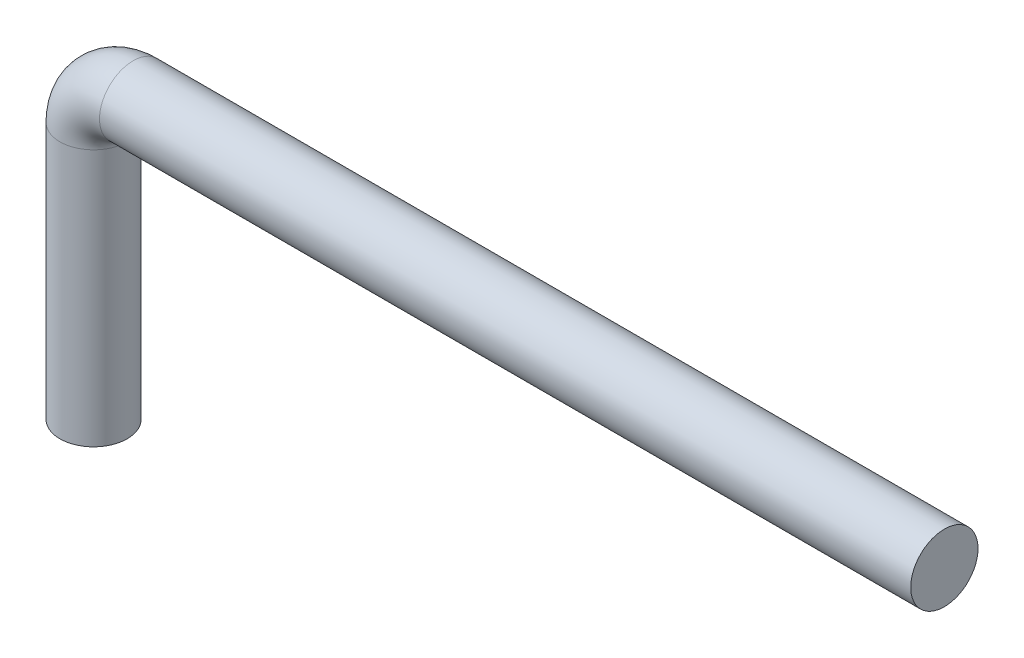
ISO-10303-21;
HEADER;
FILE_DESCRIPTION(('STEP AP214'),'2;1');
FILE_NAME('part.step','',(''),(''),'','','');
FILE_SCHEMA(('AUTOMOTIVE_DESIGN { 1 0 10303 214 1 1 1 1 }'));
ENDSEC;
DATA;
#1=APPLICATION_CONTEXT('core data for automotive mechanical design processes');
#2=APPLICATION_PROTOCOL_DEFINITION('international standard','automotive_design',2000,#1);
#3=PRODUCT_CONTEXT('',#1,'mechanical');
#4=PRODUCT('Part','Part','',(#3));
#5=PRODUCT_RELATED_PRODUCT_CATEGORY('part','',(#4));
#6=PRODUCT_DEFINITION_FORMATION('','',#4);
#7=PRODUCT_DEFINITION_CONTEXT('part definition',#1,'design');
#8=PRODUCT_DEFINITION('design','',#6,#7);
#9=PRODUCT_DEFINITION_SHAPE('','',#8);
#10=(LENGTH_UNIT() NAMED_UNIT(*) SI_UNIT(.MILLI.,.METRE.));
#11=(NAMED_UNIT(*) PLANE_ANGLE_UNIT() SI_UNIT($,.RADIAN.));
#12=(NAMED_UNIT(*) SI_UNIT($,.STERADIAN.) SOLID_ANGLE_UNIT());
#13=UNCERTAINTY_MEASURE_WITH_UNIT(LENGTH_MEASURE(1.E-05),#10,'distance_accuracy_value','');
#14=(GEOMETRIC_REPRESENTATION_CONTEXT(3) GLOBAL_UNCERTAINTY_ASSIGNED_CONTEXT((#13)) GLOBAL_UNIT_ASSIGNED_CONTEXT((#10,
#11,#12)) REPRESENTATION_CONTEXT('',''));
#15=CARTESIAN_POINT('',(0.,0.,0.));
#16=DIRECTION('',(0.,0.,1.));
#17=DIRECTION('',(1.,0.,0.));
#18=AXIS2_PLACEMENT_3D('',#15,#16,#17);
#19=CARTESIAN_POINT('',(0.,0.,0.));
#20=DIRECTION('',(1.,0.,0.));
#21=DIRECTION('',(0.,0.,-1.));
#22=AXIS2_PLACEMENT_3D('',#19,#20,#21);
#23=PLANE('',#22);
#24=CARTESIAN_POINT('',(0.,0.,0.));
#25=DIRECTION('',(1.,0.,0.));
#26=DIRECTION('',(0.,0.,-1.));
#27=AXIS2_PLACEMENT_3D('',#24,#25,#26);
#28=CIRCLE('',#27,10.795);
#29=CARTESIAN_POINT('',(0.,0.,-10.795));
#30=VERTEX_POINT('',#29);
#31=EDGE_CURVE('E46',#30,#30,#28,.T.);
#32=ORIENTED_EDGE('',*,*,#31,.T.);
#33=EDGE_LOOP('',(#32));
#34=FACE_BOUND('',#33,.T.);
#35=ADVANCED_FACE('F34',(#34),#23,.T.);
#36=CARTESIAN_POINT('',(-273.05,-95.25,0.));
#37=DIRECTION('',(0.,1.,0.));
#38=DIRECTION('',(0.,0.,-1.));
#39=AXIS2_PLACEMENT_3D('',#36,#37,#38);
#40=PLANE('',#39);
#41=CARTESIAN_POINT('',(-273.05,-95.25,0.));
#42=DIRECTION('',(0.,1.,0.));
#43=DIRECTION('',(0.,0.,-1.));
#44=AXIS2_PLACEMENT_3D('',#41,#42,#43);
#45=CIRCLE('',#44,10.795);
#46=CARTESIAN_POINT('',(-273.05,-95.25,-10.795));
#47=VERTEX_POINT('',#46);
#48=EDGE_CURVE('E11',#47,#47,#45,.T.);
#49=ORIENTED_EDGE('',*,*,#48,.F.);
#50=EDGE_LOOP('',(#49));
#51=FACE_BOUND('',#50,.T.);
#52=ADVANCED_FACE('F52',(#51),#40,.F.);
#53=CARTESIAN_POINT('',(0.,0.,0.));
#54=DIRECTION('',(-1.,0.,0.));
#55=DIRECTION('',(0.,0.,1.));
#56=AXIS2_PLACEMENT_3D('',#53,#54,#55);
#57=CYLINDRICAL_SURFACE('',#56,10.795);
#58=CARTESIAN_POINT('',(-260.35,0.,0.));
#59=DIRECTION('',(1.,0.,0.));
#60=DIRECTION('',(0.,0.,-1.));
#61=AXIS2_PLACEMENT_3D('',#58,#59,#60);
#62=CIRCLE('',#61,10.795);
#63=CARTESIAN_POINT('',(-260.35,10.795,0.));
#64=VERTEX_POINT('',#63);
#65=EDGE_CURVE('E77',#64,#64,#62,.T.);
#66=ORIENTED_EDGE('',*,*,#65,.T.);
#67=EDGE_LOOP('',(#66));
#68=FACE_BOUND('',#67,.T.);
#69=ORIENTED_EDGE('',*,*,#31,.F.);
#70=EDGE_LOOP('',(#69));
#71=FACE_BOUND('',#70,.T.);
#72=ADVANCED_FACE('F54',(#68,#71),#57,.T.);
#73=CARTESIAN_POINT('',(-260.35,-12.7,0.));
#74=DIRECTION('',(0.,0.,1.));
#75=DIRECTION('',(1.,0.,0.));
#76=AXIS2_PLACEMENT_3D('',#73,#74,#75);
#77=TOROIDAL_SURFACE('',#76,12.7,10.795);
#78=CARTESIAN_POINT('',(-273.05,-12.7000000000001,0.));
#79=DIRECTION('',(0.,1.,0.));
#80=DIRECTION('',(0.,0.,-1.));
#81=AXIS2_PLACEMENT_3D('',#78,#79,#80);
#82=CIRCLE('',#81,10.795);
#83=CARTESIAN_POINT('',(-283.845,-12.7000000000002,0.));
#84=VERTEX_POINT('',#83);
#85=EDGE_CURVE('E41',#84,#84,#82,.T.);
#86=CARTESIAN_POINT('',(-260.35,-12.7,0.));
#87=DIRECTION('',(0.,0.,1.));
#88=DIRECTION('',(1.,0.,0.));
#89=AXIS2_PLACEMENT_3D('',#86,#87,#88);
#90=CIRCLE('',#89,23.495);
#91=EDGE_CURVE('',#64,#84,#90,.T.);
#92=ORIENTED_EDGE('',*,*,#65,.F.);
#93=ORIENTED_EDGE('',*,*,#85,.T.);
#94=ORIENTED_EDGE('',*,*,#91,.T.);
#95=ORIENTED_EDGE('',*,*,#91,.F.);
#96=EDGE_LOOP('',(#92,#94,#93,#95));
#97=FACE_BOUND('',#96,.T.);
#98=ADVANCED_FACE('F59',(#97),#77,.T.);
#99=CARTESIAN_POINT('',(-273.05,-12.7000000000001,0.));
#100=DIRECTION('',(0.,-1.,0.));
#101=DIRECTION('',(0.,0.,-1.));
#102=AXIS2_PLACEMENT_3D('',#99,#100,#101);
#103=CYLINDRICAL_SURFACE('',#102,10.795);
#104=ORIENTED_EDGE('',*,*,#48,.T.);
#105=EDGE_LOOP('',(#104));
#106=FACE_BOUND('',#105,.T.);
#107=ORIENTED_EDGE('',*,*,#85,.F.);
#108=EDGE_LOOP('',(#107));
#109=FACE_BOUND('',#108,.T.);
#110=ADVANCED_FACE('F49',(#106,#109),#103,.T.);
#111=CLOSED_SHELL('',(#35,#52,#72,#98,#110));
#112=MANIFOLD_SOLID_BREP('B2',#111);
#113=ADVANCED_BREP_SHAPE_REPRESENTATION('',(#18,#112),#14);
#114=SHAPE_DEFINITION_REPRESENTATION(#9,#113);
ENDSEC;
END-ISO-10303-21;
